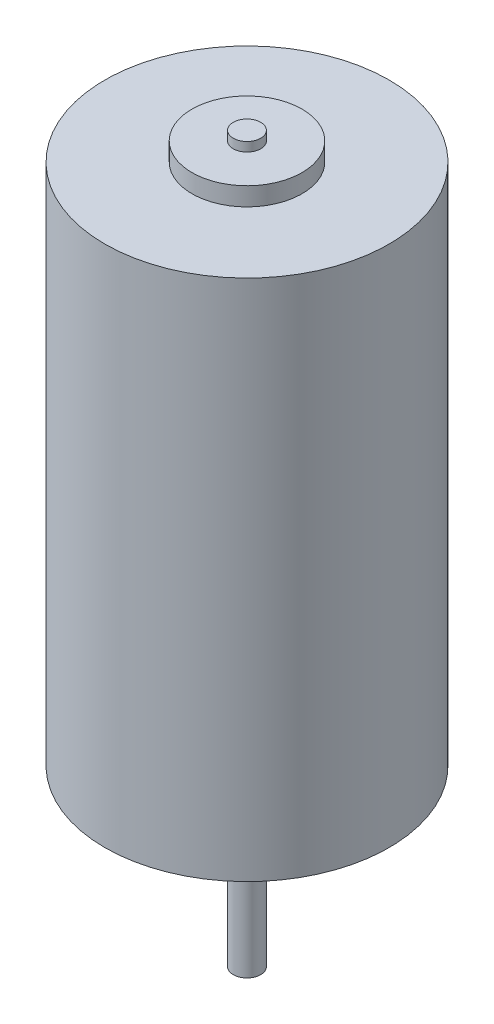
ISO-10303-21;
HEADER;
FILE_DESCRIPTION(('STEP AP214'),'2;1');
FILE_NAME('part.step','',(''),(''),'','','');
FILE_SCHEMA(('AUTOMOTIVE_DESIGN { 1 0 10303 214 1 1 1 1 }'));
ENDSEC;
DATA;
#1=APPLICATION_CONTEXT('core data for automotive mechanical design processes');
#2=APPLICATION_PROTOCOL_DEFINITION('international standard','automotive_design',2000,#1);
#3=PRODUCT_CONTEXT('',#1,'mechanical');
#4=PRODUCT('Part','Part','',(#3));
#5=PRODUCT_RELATED_PRODUCT_CATEGORY('part','',(#4));
#6=PRODUCT_DEFINITION_FORMATION('','',#4);
#7=PRODUCT_DEFINITION_CONTEXT('part definition',#1,'design');
#8=PRODUCT_DEFINITION('design','',#6,#7);
#9=PRODUCT_DEFINITION_SHAPE('','',#8);
#10=(LENGTH_UNIT() NAMED_UNIT(*) SI_UNIT(.MILLI.,.METRE.));
#11=(NAMED_UNIT(*) PLANE_ANGLE_UNIT() SI_UNIT($,.RADIAN.));
#12=(NAMED_UNIT(*) SI_UNIT($,.STERADIAN.) SOLID_ANGLE_UNIT());
#13=UNCERTAINTY_MEASURE_WITH_UNIT(LENGTH_MEASURE(1.E-05),#10,'distance_accuracy_value','');
#14=(GEOMETRIC_REPRESENTATION_CONTEXT(3) GLOBAL_UNCERTAINTY_ASSIGNED_CONTEXT((#13)) GLOBAL_UNIT_ASSIGNED_CONTEXT((#10,
#11,#12)) REPRESENTATION_CONTEXT('',''));
#15=CARTESIAN_POINT('',(0.,0.,0.));
#16=DIRECTION('',(0.,0.,1.));
#17=DIRECTION('',(1.,0.,0.));
#18=AXIS2_PLACEMENT_3D('',#15,#16,#17);
#19=CARTESIAN_POINT('',(1.5,-19.,0.));
#20=DIRECTION('',(0.,-1.,0.));
#21=DIRECTION('',(0.,0.,-1.));
#22=AXIS2_PLACEMENT_3D('',#19,#20,#21);
#23=PLANE('',#22);
#24=CARTESIAN_POINT('',(0.,-19.,0.));
#25=DIRECTION('',(0.,-1.,0.));
#26=DIRECTION('',(0.,0.,-1.));
#27=AXIS2_PLACEMENT_3D('',#24,#25,#26);
#28=CIRCLE('',#27,1.5);
#29=CARTESIAN_POINT('',(0.,-19.,-1.5));
#30=VERTEX_POINT('',#29);
#31=EDGE_CURVE('E90',#30,#30,#28,.T.);
#32=ORIENTED_EDGE('',*,*,#31,.T.);
#33=EDGE_LOOP('',(#32));
#34=FACE_BOUND('',#33,.T.);
#35=ADVANCED_FACE('F37',(#34),#23,.T.);
#36=CARTESIAN_POINT('',(0.,60.,0.));
#37=DIRECTION('',(0.,1.,0.));
#38=DIRECTION('',(0.,0.,1.));
#39=AXIS2_PLACEMENT_3D('',#36,#37,#38);
#40=PLANE('',#39);
#41=CARTESIAN_POINT('',(0.,60.,0.));
#42=DIRECTION('',(0.,-1.,0.));
#43=DIRECTION('',(0.,0.,-1.));
#44=AXIS2_PLACEMENT_3D('',#41,#42,#43);
#45=CIRCLE('',#44,1.5);
#46=CARTESIAN_POINT('',(0.,60.,-1.5));
#47=VERTEX_POINT('',#46);
#48=EDGE_CURVE('E11',#47,#47,#45,.T.);
#49=ORIENTED_EDGE('',*,*,#48,.F.);
#50=EDGE_LOOP('',(#49));
#51=FACE_BOUND('',#50,.T.);
#52=ADVANCED_FACE('F121',(#51),#40,.T.);
#53=CARTESIAN_POINT('',(0.,0.,0.));
#54=DIRECTION('',(0.,-1.,0.));
#55=DIRECTION('',(0.,0.,-1.));
#56=AXIS2_PLACEMENT_3D('',#53,#54,#55);
#57=CYLINDRICAL_SURFACE('',#56,1.49999999999999);
#58=ORIENTED_EDGE('',*,*,#48,.T.);
#59=EDGE_LOOP('',(#58));
#60=FACE_BOUND('',#59,.T.);
#61=CARTESIAN_POINT('',(0.,59.,0.));
#62=DIRECTION('',(0.,-1.,0.));
#63=DIRECTION('',(0.,0.,-1.));
#64=AXIS2_PLACEMENT_3D('',#61,#62,#63);
#65=CIRCLE('',#64,1.49999999999999);
#66=CARTESIAN_POINT('',(0.,59.,-1.49999999999999));
#67=VERTEX_POINT('',#66);
#68=EDGE_CURVE('E44',#67,#67,#65,.T.);
#69=ORIENTED_EDGE('',*,*,#68,.F.);
#70=EDGE_LOOP('',(#69));
#71=FACE_BOUND('',#70,.T.);
#72=ADVANCED_FACE('F119',(#60,#71),#57,.T.);
#73=CARTESIAN_POINT('',(1.49999999999999,59.,0.));
#74=DIRECTION('',(0.,1.,0.));
#75=DIRECTION('',(0.,0.,1.));
#76=AXIS2_PLACEMENT_3D('',#73,#74,#75);
#77=PLANE('',#76);
#78=ORIENTED_EDGE('',*,*,#68,.T.);
#79=EDGE_LOOP('',(#78));
#80=FACE_BOUND('',#79,.T.);
#81=CARTESIAN_POINT('',(0.,59.,0.));
#82=DIRECTION('',(0.,-1.,0.));
#83=DIRECTION('',(0.,0.,-1.));
#84=AXIS2_PLACEMENT_3D('',#81,#82,#83);
#85=CIRCLE('',#84,6.);
#86=CARTESIAN_POINT('',(0.,59.,-6.));
#87=VERTEX_POINT('',#86);
#88=EDGE_CURVE('E111',#87,#87,#85,.T.);
#89=ORIENTED_EDGE('',*,*,#88,.F.);
#90=EDGE_LOOP('',(#89));
#91=FACE_BOUND('',#90,.T.);
#92=ADVANCED_FACE('F116',(#80,#91),#77,.T.);
#93=CARTESIAN_POINT('',(0.,0.,0.));
#94=DIRECTION('',(0.,-1.,0.));
#95=DIRECTION('',(0.,0.,-1.));
#96=AXIS2_PLACEMENT_3D('',#93,#94,#95);
#97=CYLINDRICAL_SURFACE('',#96,6.);
#98=ORIENTED_EDGE('',*,*,#88,.T.);
#99=EDGE_LOOP('',(#98));
#100=FACE_BOUND('',#99,.T.);
#101=CARTESIAN_POINT('',(0.,57.,0.));
#102=DIRECTION('',(0.,-1.,0.));
#103=DIRECTION('',(0.,0.,-1.));
#104=AXIS2_PLACEMENT_3D('',#101,#102,#103);
#105=CIRCLE('',#104,6.);
#106=CARTESIAN_POINT('',(0.,57.,-6.));
#107=VERTEX_POINT('',#106);
#108=EDGE_CURVE('E108',#107,#107,#105,.T.);
#109=ORIENTED_EDGE('',*,*,#108,.F.);
#110=EDGE_LOOP('',(#109));
#111=FACE_BOUND('',#110,.T.);
#112=ADVANCED_FACE('F128',(#100,#111),#97,.T.);
#113=CARTESIAN_POINT('',(6.,57.,0.));
#114=DIRECTION('',(0.,1.,0.));
#115=DIRECTION('',(0.,0.,1.));
#116=AXIS2_PLACEMENT_3D('',#113,#114,#115);
#117=PLANE('',#116);
#118=ORIENTED_EDGE('',*,*,#108,.T.);
#119=EDGE_LOOP('',(#118));
#120=FACE_BOUND('',#119,.T.);
#121=CARTESIAN_POINT('',(0.,57.,0.));
#122=DIRECTION('',(0.,-1.,0.));
#123=DIRECTION('',(0.,0.,-1.));
#124=AXIS2_PLACEMENT_3D('',#121,#122,#123);
#125=CIRCLE('',#124,15.5);
#126=CARTESIAN_POINT('',(0.,57.,-15.5));
#127=VERTEX_POINT('',#126);
#128=EDGE_CURVE('E105',#127,#127,#125,.T.);
#129=ORIENTED_EDGE('',*,*,#128,.F.);
#130=EDGE_LOOP('',(#129));
#131=FACE_BOUND('',#130,.T.);
#132=ADVANCED_FACE('F164',(#120,#131),#117,.T.);
#133=CARTESIAN_POINT('',(0.,0.,0.));
#134=DIRECTION('',(0.,-1.,0.));
#135=DIRECTION('',(0.,0.,-1.));
#136=AXIS2_PLACEMENT_3D('',#133,#134,#135);
#137=CYLINDRICAL_SURFACE('',#136,15.5);
#138=ORIENTED_EDGE('',*,*,#128,.T.);
#139=EDGE_LOOP('',(#138));
#140=FACE_BOUND('',#139,.T.);
#141=CARTESIAN_POINT('',(0.,0.,0.));
#142=DIRECTION('',(0.,-1.,0.));
#143=DIRECTION('',(0.,0.,-1.));
#144=AXIS2_PLACEMENT_3D('',#141,#142,#143);
#145=CIRCLE('',#144,15.5);
#146=CARTESIAN_POINT('',(0.,0.,-15.5));
#147=VERTEX_POINT('',#146);
#148=EDGE_CURVE('E102',#147,#147,#145,.T.);
#149=ORIENTED_EDGE('',*,*,#148,.F.);
#150=EDGE_LOOP('',(#149));
#151=FACE_BOUND('',#150,.T.);
#152=ADVANCED_FACE('F160',(#140,#151),#137,.T.);
#153=CARTESIAN_POINT('',(15.5,0.,0.));
#154=DIRECTION('',(0.,-1.,0.));
#155=DIRECTION('',(0.,0.,-1.));
#156=AXIS2_PLACEMENT_3D('',#153,#154,#155);
#157=PLANE('',#156);
#158=CARTESIAN_POINT('',(0.,0.,11.));
#159=DIRECTION('',(0.,-1.,0.));
#160=DIRECTION('',(0.,0.,-1.));
#161=AXIS2_PLACEMENT_3D('',#158,#159,#160);
#162=CIRCLE('',#161,1.25);
#163=CARTESIAN_POINT('',(0.,0.,9.75));
#164=VERTEX_POINT('',#163);
#165=EDGE_CURVE('E68',#164,#164,#162,.T.);
#166=ORIENTED_EDGE('',*,*,#165,.F.);
#167=EDGE_LOOP('',(#166));
#168=FACE_BOUND('',#167,.T.);
#169=CARTESIAN_POINT('',(11.,0.,0.));
#170=DIRECTION('',(0.,-1.,0.));
#171=DIRECTION('',(0.,0.,-1.));
#172=AXIS2_PLACEMENT_3D('',#169,#170,#171);
#173=CIRCLE('',#172,1.25);
#174=CARTESIAN_POINT('',(11.,0.,-1.25));
#175=VERTEX_POINT('',#174);
#176=EDGE_CURVE('E67',#175,#175,#173,.T.);
#177=ORIENTED_EDGE('',*,*,#176,.F.);
#178=EDGE_LOOP('',(#177));
#179=FACE_BOUND('',#178,.T.);
#180=CARTESIAN_POINT('',(0.,0.,-11.));
#181=DIRECTION('',(0.,-1.,0.));
#182=DIRECTION('',(0.,0.,-1.));
#183=AXIS2_PLACEMENT_3D('',#180,#181,#182);
#184=CIRCLE('',#183,1.25);
#185=CARTESIAN_POINT('',(0.,0.,-12.25));
#186=VERTEX_POINT('',#185);
#187=EDGE_CURVE('E78',#186,#186,#184,.T.);
#188=ORIENTED_EDGE('',*,*,#187,.F.);
#189=EDGE_LOOP('',(#188));
#190=FACE_BOUND('',#189,.T.);
#191=CARTESIAN_POINT('',(-11.,0.,0.));
#192=DIRECTION('',(0.,-1.,0.));
#193=DIRECTION('',(0.,0.,-1.));
#194=AXIS2_PLACEMENT_3D('',#191,#192,#193);
#195=CIRCLE('',#194,1.25);
#196=CARTESIAN_POINT('',(-11.,0.,-1.25));
#197=VERTEX_POINT('',#196);
#198=EDGE_CURVE('E84',#197,#197,#195,.T.);
#199=ORIENTED_EDGE('',*,*,#198,.F.);
#200=EDGE_LOOP('',(#199));
#201=FACE_BOUND('',#200,.T.);
#202=ORIENTED_EDGE('',*,*,#148,.T.);
#203=EDGE_LOOP('',(#202));
#204=FACE_BOUND('',#203,.T.);
#205=CARTESIAN_POINT('',(0.,0.,0.));
#206=DIRECTION('',(0.,-1.,0.));
#207=DIRECTION('',(0.,0.,-1.));
#208=AXIS2_PLACEMENT_3D('',#205,#206,#207);
#209=CIRCLE('',#208,6.);
#210=CARTESIAN_POINT('',(0.,0.,-6.));
#211=VERTEX_POINT('',#210);
#212=EDGE_CURVE('E99',#211,#211,#209,.T.);
#213=ORIENTED_EDGE('',*,*,#212,.F.);
#214=EDGE_LOOP('',(#213));
#215=FACE_BOUND('',#214,.T.);
#216=ADVANCED_FACE('F156',(#168,#179,#190,#201,#204,#215),#157,.T.);
#217=CARTESIAN_POINT('',(0.,0.,0.));
#218=DIRECTION('',(0.,-1.,0.));
#219=DIRECTION('',(0.,0.,-1.));
#220=AXIS2_PLACEMENT_3D('',#217,#218,#219);
#221=CYLINDRICAL_SURFACE('',#220,6.);
#222=ORIENTED_EDGE('',*,*,#212,.T.);
#223=EDGE_LOOP('',(#222));
#224=FACE_BOUND('',#223,.T.);
#225=CARTESIAN_POINT('',(0.,-3.5,0.));
#226=DIRECTION('',(0.,-1.,0.));
#227=DIRECTION('',(0.,0.,-1.));
#228=AXIS2_PLACEMENT_3D('',#225,#226,#227);
#229=CIRCLE('',#228,6.);
#230=CARTESIAN_POINT('',(0.,-3.5,-6.));
#231=VERTEX_POINT('',#230);
#232=EDGE_CURVE('E96',#231,#231,#229,.T.);
#233=ORIENTED_EDGE('',*,*,#232,.F.);
#234=EDGE_LOOP('',(#233));
#235=FACE_BOUND('',#234,.T.);
#236=ADVANCED_FACE('F149',(#224,#235),#221,.T.);
#237=CARTESIAN_POINT('',(1.5,-3.5,0.));
#238=DIRECTION('',(0.,-1.,0.));
#239=DIRECTION('',(0.,0.,-1.));
#240=AXIS2_PLACEMENT_3D('',#237,#238,#239);
#241=PLANE('',#240);
#242=ORIENTED_EDGE('',*,*,#232,.T.);
#243=EDGE_LOOP('',(#242));
#244=FACE_BOUND('',#243,.T.);
#245=CARTESIAN_POINT('',(0.,-3.5,0.));
#246=DIRECTION('',(0.,-1.,0.));
#247=DIRECTION('',(0.,0.,-1.));
#248=AXIS2_PLACEMENT_3D('',#245,#246,#247);
#249=CIRCLE('',#248,1.5);
#250=CARTESIAN_POINT('',(0.,-3.5,-1.5));
#251=VERTEX_POINT('',#250);
#252=EDGE_CURVE('E93',#251,#251,#249,.T.);
#253=ORIENTED_EDGE('',*,*,#252,.F.);
#254=EDGE_LOOP('',(#253));
#255=FACE_BOUND('',#254,.T.);
#256=ADVANCED_FACE('F140',(#244,#255),#241,.T.);
#257=CARTESIAN_POINT('',(0.,0.,0.));
#258=DIRECTION('',(0.,-1.,0.));
#259=DIRECTION('',(0.,0.,-1.));
#260=AXIS2_PLACEMENT_3D('',#257,#258,#259);
#261=CYLINDRICAL_SURFACE('',#260,1.5);
#262=ORIENTED_EDGE('',*,*,#252,.T.);
#263=EDGE_LOOP('',(#262));
#264=FACE_BOUND('',#263,.T.);
#265=ORIENTED_EDGE('',*,*,#31,.F.);
#266=EDGE_LOOP('',(#265));
#267=FACE_BOUND('',#266,.T.);
#268=ADVANCED_FACE('F137',(#264,#267),#261,.T.);
#269=CARTESIAN_POINT('',(-11.,8.5,0.));
#270=DIRECTION('',(0.,-1.,0.));
#271=DIRECTION('',(0.,0.,-1.));
#272=AXIS2_PLACEMENT_3D('',#269,#270,#271);
#273=CONICAL_SURFACE('',#272,1.25,1.02974425867665);
#274=CARTESIAN_POINT('',(-11.,9.25107577378445,0.));
#275=VERTEX_POINT('',#274);
#276=VERTEX_LOOP('',#275);
#277=FACE_BOUND('',#276,.T.);
#278=CARTESIAN_POINT('',(-11.,8.5,0.));
#279=DIRECTION('',(0.,-1.,0.));
#280=DIRECTION('',(0.,0.,-1.));
#281=AXIS2_PLACEMENT_3D('',#278,#279,#280);
#282=CIRCLE('',#281,1.25);
#283=CARTESIAN_POINT('',(-11.,8.5,-1.25));
#284=VERTEX_POINT('',#283);
#285=EDGE_CURVE('E87',#284,#284,#282,.T.);
#286=ORIENTED_EDGE('',*,*,#285,.T.);
#287=EDGE_LOOP('',(#286));
#288=FACE_BOUND('',#287,.T.);
#289=ADVANCED_FACE('F139',(#277,#288),#273,.F.);
#290=CARTESIAN_POINT('',(-11.,0.,0.));
#291=DIRECTION('',(0.,-1.,0.));
#292=DIRECTION('',(0.,0.,-1.));
#293=AXIS2_PLACEMENT_3D('',#290,#291,#292);
#294=CYLINDRICAL_SURFACE('',#293,1.25);
#295=ORIENTED_EDGE('',*,*,#285,.F.);
#296=EDGE_LOOP('',(#295));
#297=FACE_BOUND('',#296,.T.);
#298=ORIENTED_EDGE('',*,*,#198,.T.);
#299=EDGE_LOOP('',(#298));
#300=FACE_BOUND('',#299,.T.);
#301=ADVANCED_FACE('F147',(#297,#300),#294,.F.);
#302=CARTESIAN_POINT('',(0.,8.5,-11.));
#303=DIRECTION('',(0.,-1.,0.));
#304=DIRECTION('',(0.,0.,-1.));
#305=AXIS2_PLACEMENT_3D('',#302,#303,#304);
#306=CONICAL_SURFACE('',#305,1.25,1.02974425867665);
#307=CARTESIAN_POINT('',(0.,9.25107577378445,-11.));
#308=VERTEX_POINT('',#307);
#309=VERTEX_LOOP('',#308);
#310=FACE_BOUND('',#309,.T.);
#311=CARTESIAN_POINT('',(0.,8.5,-11.));
#312=DIRECTION('',(0.,-1.,0.));
#313=DIRECTION('',(0.,0.,-1.));
#314=AXIS2_PLACEMENT_3D('',#311,#312,#313);
#315=CIRCLE('',#314,1.25);
#316=CARTESIAN_POINT('',(0.,8.5,-12.25));
#317=VERTEX_POINT('',#316);
#318=EDGE_CURVE('E81',#317,#317,#315,.T.);
#319=ORIENTED_EDGE('',*,*,#318,.T.);
#320=EDGE_LOOP('',(#319));
#321=FACE_BOUND('',#320,.T.);
#322=ADVANCED_FACE('F230',(#310,#321),#306,.F.);
#323=CARTESIAN_POINT('',(0.,0.,-11.));
#324=DIRECTION('',(0.,-1.,0.));
#325=DIRECTION('',(0.,0.,-1.));
#326=AXIS2_PLACEMENT_3D('',#323,#324,#325);
#327=CYLINDRICAL_SURFACE('',#326,1.25);
#328=ORIENTED_EDGE('',*,*,#318,.F.);
#329=EDGE_LOOP('',(#328));
#330=FACE_BOUND('',#329,.T.);
#331=ORIENTED_EDGE('',*,*,#187,.T.);
#332=EDGE_LOOP('',(#331));
#333=FACE_BOUND('',#332,.T.);
#334=ADVANCED_FACE('F239',(#330,#333),#327,.F.);
#335=CARTESIAN_POINT('',(11.,8.5,0.));
#336=DIRECTION('',(0.,-1.,0.));
#337=DIRECTION('',(0.,0.,-1.));
#338=AXIS2_PLACEMENT_3D('',#335,#336,#337);
#339=CONICAL_SURFACE('',#338,1.25,1.02974425867665);
#340=CARTESIAN_POINT('',(11.,9.25107577378445,0.));
#341=VERTEX_POINT('',#340);
#342=VERTEX_LOOP('',#341);
#343=FACE_BOUND('',#342,.T.);
#344=CARTESIAN_POINT('',(11.,8.5,0.));
#345=DIRECTION('',(0.,-1.,0.));
#346=DIRECTION('',(0.,0.,-1.));
#347=AXIS2_PLACEMENT_3D('',#344,#345,#346);
#348=CIRCLE('',#347,1.25);
#349=CARTESIAN_POINT('',(11.,8.5,-1.25));
#350=VERTEX_POINT('',#349);
#351=EDGE_CURVE('E71',#350,#350,#348,.T.);
#352=ORIENTED_EDGE('',*,*,#351,.T.);
#353=EDGE_LOOP('',(#352));
#354=FACE_BOUND('',#353,.T.);
#355=ADVANCED_FACE('F247',(#343,#354),#339,.F.);
#356=CARTESIAN_POINT('',(11.,0.,0.));
#357=DIRECTION('',(0.,-1.,0.));
#358=DIRECTION('',(0.,0.,-1.));
#359=AXIS2_PLACEMENT_3D('',#356,#357,#358);
#360=CYLINDRICAL_SURFACE('',#359,1.25);
#361=ORIENTED_EDGE('',*,*,#351,.F.);
#362=EDGE_LOOP('',(#361));
#363=FACE_BOUND('',#362,.T.);
#364=ORIENTED_EDGE('',*,*,#176,.T.);
#365=EDGE_LOOP('',(#364));
#366=FACE_BOUND('',#365,.T.);
#367=ADVANCED_FACE('F61',(#363,#366),#360,.F.);
#368=CARTESIAN_POINT('',(0.,8.5,11.));
#369=DIRECTION('',(0.,-1.,0.));
#370=DIRECTION('',(0.,0.,-1.));
#371=AXIS2_PLACEMENT_3D('',#368,#369,#370);
#372=CONICAL_SURFACE('',#371,1.25,1.02974425867665);
#373=CARTESIAN_POINT('',(0.,9.25107577378445,11.));
#374=VERTEX_POINT('',#373);
#375=VERTEX_LOOP('',#374);
#376=FACE_BOUND('',#375,.T.);
#377=CARTESIAN_POINT('',(0.,8.5,11.));
#378=DIRECTION('',(0.,-1.,0.));
#379=DIRECTION('',(0.,0.,-1.));
#380=AXIS2_PLACEMENT_3D('',#377,#378,#379);
#381=CIRCLE('',#380,1.25);
#382=CARTESIAN_POINT('',(0.,8.5,9.75));
#383=VERTEX_POINT('',#382);
#384=EDGE_CURVE('E65',#383,#383,#381,.T.);
#385=ORIENTED_EDGE('',*,*,#384,.T.);
#386=EDGE_LOOP('',(#385));
#387=FACE_BOUND('',#386,.T.);
#388=ADVANCED_FACE('F57',(#376,#387),#372,.F.);
#389=CARTESIAN_POINT('',(0.,0.,11.));
#390=DIRECTION('',(0.,-1.,0.));
#391=DIRECTION('',(0.,0.,-1.));
#392=AXIS2_PLACEMENT_3D('',#389,#390,#391);
#393=CYLINDRICAL_SURFACE('',#392,1.25);
#394=ORIENTED_EDGE('',*,*,#384,.F.);
#395=EDGE_LOOP('',(#394));
#396=FACE_BOUND('',#395,.T.);
#397=ORIENTED_EDGE('',*,*,#165,.T.);
#398=EDGE_LOOP('',(#397));
#399=FACE_BOUND('',#398,.T.);
#400=ADVANCED_FACE('F60',(#396,#399),#393,.F.);
#401=CLOSED_SHELL('',(#35,#52,#72,#92,#112,#132,#152,#216,#236,#256,#268,#289,#301,#322,#334,
#355,#367,#388,#400));
#402=MANIFOLD_SOLID_BREP('B2',#401);
#403=ADVANCED_BREP_SHAPE_REPRESENTATION('',(#18,#402),#14);
#404=SHAPE_DEFINITION_REPRESENTATION(#9,#403);
ENDSEC;
END-ISO-10303-21;
